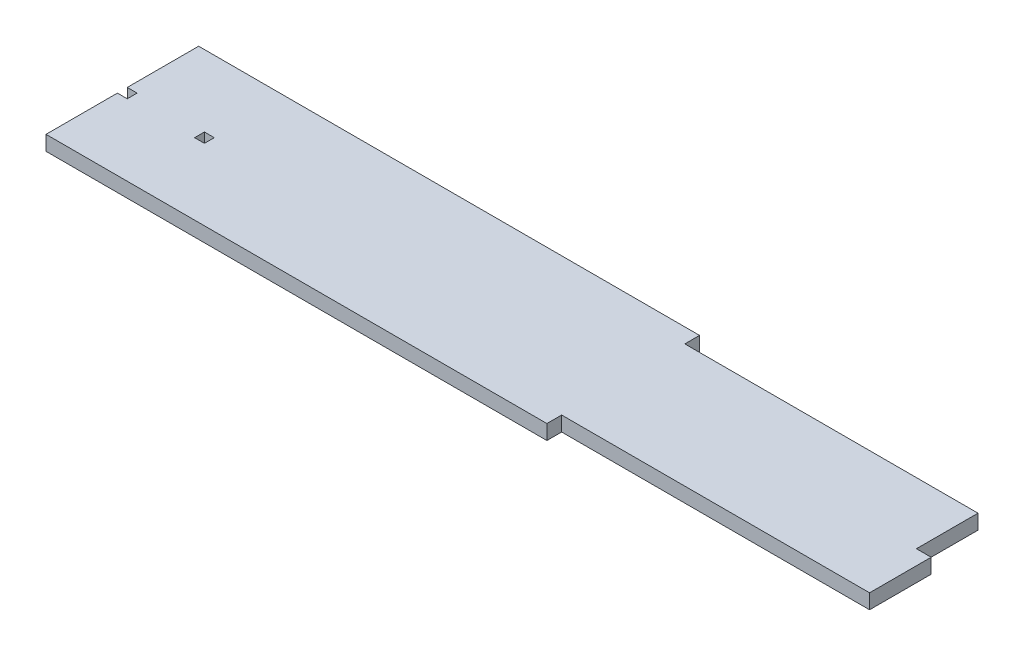
ISO-10303-21;
HEADER;
FILE_DESCRIPTION(('STEP AP214'),'2;1');
FILE_NAME('part.step','',(''),(''),'','','');
FILE_SCHEMA(('AUTOMOTIVE_DESIGN { 1 0 10303 214 1 1 1 1 }'));
ENDSEC;
DATA;
#1=APPLICATION_CONTEXT('core data for automotive mechanical design processes');
#2=APPLICATION_PROTOCOL_DEFINITION('international standard','automotive_design',2000,#1);
#3=PRODUCT_CONTEXT('',#1,'mechanical');
#4=PRODUCT('Part','Part','',(#3));
#5=PRODUCT_RELATED_PRODUCT_CATEGORY('part','',(#4));
#6=PRODUCT_DEFINITION_FORMATION('','',#4);
#7=PRODUCT_DEFINITION_CONTEXT('part definition',#1,'design');
#8=PRODUCT_DEFINITION('design','',#6,#7);
#9=PRODUCT_DEFINITION_SHAPE('','',#8);
#10=(LENGTH_UNIT() NAMED_UNIT(*) SI_UNIT(.MILLI.,.METRE.));
#11=(NAMED_UNIT(*) PLANE_ANGLE_UNIT() SI_UNIT($,.RADIAN.));
#12=(NAMED_UNIT(*) SI_UNIT($,.STERADIAN.) SOLID_ANGLE_UNIT());
#13=UNCERTAINTY_MEASURE_WITH_UNIT(LENGTH_MEASURE(1.E-05),#10,'distance_accuracy_value','');
#14=(GEOMETRIC_REPRESENTATION_CONTEXT(3) GLOBAL_UNCERTAINTY_ASSIGNED_CONTEXT((#13)) GLOBAL_UNIT_ASSIGNED_CONTEXT((#10,
#11,#12)) REPRESENTATION_CONTEXT('',''));
#15=CARTESIAN_POINT('',(0.,0.,0.));
#16=DIRECTION('',(0.,0.,1.));
#17=DIRECTION('',(1.,0.,0.));
#18=AXIS2_PLACEMENT_3D('',#15,#16,#17);
#19=CARTESIAN_POINT('',(0.,4.5593,-23.6093));
#20=DIRECTION('',(0.,0.,1.));
#21=DIRECTION('',(1.,0.,0.));
#22=AXIS2_PLACEMENT_3D('',#19,#20,#21);
#23=PLANE('',#22);
#24=DIRECTION('',(0.,1.,0.));
#25=VECTOR('',#24,1.);
#26=CARTESIAN_POINT('',(29.8450000000573,25.4000000000007,-23.6092999999844));
#27=LINE('',#26,#25);
#28=CARTESIAN_POINT('',(29.8450000000573,6.66133814775094E-13,-23.6092999999844));
#29=VERTEX_POINT('',#28);
#30=CARTESIAN_POINT('',(29.8450000000573,4.5593,-23.6092999999844));
#31=VERTEX_POINT('',#30);
#32=EDGE_CURVE('E237',#29,#31,#27,.T.);
#33=ORIENTED_EDGE('',*,*,#32,.F.);
#34=DIRECTION('',(-1.,0.,0.));
#35=VECTOR('',#34,1.);
#36=CARTESIAN_POINT('',(0.,0.,-23.6093));
#37=LINE('',#36,#35);
#38=CARTESIAN_POINT('',(-125.095,0.,-23.6093));
#39=VERTEX_POINT('',#38);
#40=EDGE_CURVE('E236',#29,#39,#37,.T.);
#41=ORIENTED_EDGE('',*,*,#40,.T.);
#42=DIRECTION('',(0.,-1.,0.));
#43=VECTOR('',#42,1.);
#44=CARTESIAN_POINT('',(-125.095,4.5593,-23.6093));
#45=LINE('',#44,#43);
#46=CARTESIAN_POINT('',(-125.095,4.5593,-23.6093));
#47=VERTEX_POINT('',#46);
#48=EDGE_CURVE('E38',#47,#39,#45,.T.);
#49=ORIENTED_EDGE('',*,*,#48,.F.);
#50=DIRECTION('',(-1.,0.,0.));
#51=VECTOR('',#50,1.);
#52=CARTESIAN_POINT('',(0.,4.5593,-23.6093));
#53=LINE('',#52,#51);
#54=EDGE_CURVE('E202',#31,#47,#53,.T.);
#55=ORIENTED_EDGE('',*,*,#54,.F.);
#56=EDGE_LOOP('',(#33,#41,#49,#55));
#57=FACE_BOUND('',#56,.T.);
#58=ADVANCED_FACE('F35',(#57),#23,.F.);
#59=CARTESIAN_POINT('',(0.,4.5593,23.6093));
#60=DIRECTION('',(0.,0.,1.));
#61=DIRECTION('',(1.,0.,0.));
#62=AXIS2_PLACEMENT_3D('',#59,#60,#61);
#63=PLANE('',#62);
#64=DIRECTION('',(-1.,0.,0.));
#65=VECTOR('',#64,1.);
#66=CARTESIAN_POINT('',(0.,0.,23.6093));
#67=LINE('',#66,#65);
#68=CARTESIAN_POINT('',(29.8449999999997,0.,23.6093));
#69=VERTEX_POINT('',#68);
#70=CARTESIAN_POINT('',(-125.095,0.,23.6093));
#71=VERTEX_POINT('',#70);
#72=EDGE_CURVE('E185',#69,#71,#67,.T.);
#73=ORIENTED_EDGE('',*,*,#72,.F.);
#74=DIRECTION('',(0.,1.,0.));
#75=VECTOR('',#74,1.);
#76=CARTESIAN_POINT('',(29.8449999999997,25.4,23.6093000000018));
#77=LINE('',#76,#75);
#78=CARTESIAN_POINT('',(29.8449999999997,4.5593,23.6093000000018));
#79=VERTEX_POINT('',#78);
#80=EDGE_CURVE('E59',#69,#79,#77,.T.);
#81=ORIENTED_EDGE('',*,*,#80,.T.);
#82=DIRECTION('',(-1.,0.,0.));
#83=VECTOR('',#82,1.);
#84=CARTESIAN_POINT('',(0.,4.5593,23.6093));
#85=LINE('',#84,#83);
#86=CARTESIAN_POINT('',(-125.095,4.5593,23.6093));
#87=VERTEX_POINT('',#86);
#88=EDGE_CURVE('E283',#79,#87,#85,.T.);
#89=ORIENTED_EDGE('',*,*,#88,.T.);
#90=DIRECTION('',(0.,-1.,0.));
#91=VECTOR('',#90,1.);
#92=CARTESIAN_POINT('',(-125.095,4.5593,23.6093));
#93=LINE('',#92,#91);
#94=EDGE_CURVE('E208',#87,#71,#93,.T.);
#95=ORIENTED_EDGE('',*,*,#94,.T.);
#96=EDGE_LOOP('',(#73,#81,#89,#95));
#97=FACE_BOUND('',#96,.T.);
#98=ADVANCED_FACE('F322',(#97),#63,.T.);
#99=CARTESIAN_POINT('',(125.095,4.5593,0.));
#100=DIRECTION('',(-1.,0.,0.));
#101=DIRECTION('',(0.,0.,1.));
#102=AXIS2_PLACEMENT_3D('',#99,#100,#101);
#103=PLANE('',#102);
#104=DIRECTION('',(0.,0.,-1.));
#105=VECTOR('',#104,1.);
#106=CARTESIAN_POINT('',(125.095,0.,0.));
#107=LINE('',#106,#105);
#108=CARTESIAN_POINT('',(125.095,0.,19.0500000000018));
#109=VERTEX_POINT('',#108);
#110=CARTESIAN_POINT('',(125.095000000057,4.19664303308309E-11,-4.47146659976472E-11));
#111=VERTEX_POINT('',#110);
#112=EDGE_CURVE('E176',#109,#111,#107,.T.);
#113=ORIENTED_EDGE('',*,*,#112,.T.);
#114=DIRECTION('',(0.,-1.,-1.91538589147791E-13));
#115=VECTOR('',#114,1.);
#116=CARTESIAN_POINT('',(125.095000000057,131.936735339986,-1.9443648080486E-11));
#117=LINE('',#116,#115);
#118=CARTESIAN_POINT('',(125.095000000057,4.55930000004198,-4.38412327274929E-11));
#119=VERTEX_POINT('',#118);
#120=EDGE_CURVE('E499',#119,#111,#117,.T.);
#121=ORIENTED_EDGE('',*,*,#120,.F.);
#122=DIRECTION('',(0.,0.,-1.));
#123=VECTOR('',#122,1.);
#124=CARTESIAN_POINT('',(125.095,4.5593,0.));
#125=LINE('',#124,#123);
#126=CARTESIAN_POINT('',(125.095000000057,4.55930000004193,19.0499999999556));
#127=VERTEX_POINT('',#126);
#128=EDGE_CURVE('E178',#127,#119,#125,.T.);
#129=ORIENTED_EDGE('',*,*,#128,.F.);
#130=DIRECTION('',(0.,-1.,0.));
#131=VECTOR('',#130,1.);
#132=CARTESIAN_POINT('',(125.095,25.4,19.0500000000018));
#133=LINE('',#132,#131);
#134=EDGE_CURVE('E165',#127,#109,#133,.T.);
#135=ORIENTED_EDGE('',*,*,#134,.T.);
#136=EDGE_LOOP('',(#113,#121,#129,#135));
#137=FACE_BOUND('',#136,.T.);
#138=ADVANCED_FACE('F174',(#137),#103,.F.);
#139=CARTESIAN_POINT('',(0.,4.5593,0.));
#140=DIRECTION('',(0.,1.,0.));
#141=DIRECTION('',(0.,0.,1.));
#142=AXIS2_PLACEMENT_3D('',#139,#140,#141);
#143=PLANE('',#142);
#144=DIRECTION('',(1.,0.,0.));
#145=VECTOR('',#144,1.);
#146=CARTESIAN_POINT('',(0.,4.5593,-1.52400000000001));
#147=LINE('',#146,#145);
#148=CARTESIAN_POINT('',(-101.219,4.5593,-1.52400000000001));
#149=VERTEX_POINT('',#148);
#150=CARTESIAN_POINT('',(-98.171,4.5593,-1.52400000000001));
#151=VERTEX_POINT('',#150);
#152=EDGE_CURVE('E286',#149,#151,#147,.T.);
#153=ORIENTED_EDGE('',*,*,#152,.T.);
#154=DIRECTION('',(0.,0.,1.));
#155=VECTOR('',#154,1.);
#156=CARTESIAN_POINT('',(-98.171,4.5593,0.));
#157=LINE('',#156,#155);
#158=CARTESIAN_POINT('',(-98.171,4.5593,1.52399999999999));
#159=VERTEX_POINT('',#158);
#160=EDGE_CURVE('E289',#151,#159,#157,.T.);
#161=ORIENTED_EDGE('',*,*,#160,.T.);
#162=DIRECTION('',(1.,0.,0.));
#163=VECTOR('',#162,1.);
#164=CARTESIAN_POINT('',(0.,4.5593,1.52399999999999));
#165=LINE('',#164,#163);
#166=CARTESIAN_POINT('',(-101.219,4.5593,1.52399999999999));
#167=VERTEX_POINT('',#166);
#168=EDGE_CURVE('E291',#167,#159,#165,.T.);
#169=ORIENTED_EDGE('',*,*,#168,.F.);
#170=DIRECTION('',(0.,0.,1.));
#171=VECTOR('',#170,1.);
#172=CARTESIAN_POINT('',(-101.219,4.5593,0.));
#173=LINE('',#172,#171);
#174=EDGE_CURVE('E212',#149,#167,#173,.T.);
#175=ORIENTED_EDGE('',*,*,#174,.F.);
#176=EDGE_LOOP('',(#153,#161,#169,#175));
#177=FACE_BOUND('',#176,.T.);
#178=DIRECTION('',(1.,0.,0.));
#179=VECTOR('',#178,1.);
#180=CARTESIAN_POINT('',(0.,4.5593,-19.0499999999844));
#181=LINE('',#180,#179);
#182=CARTESIAN_POINT('',(29.8450000000573,4.5593,-19.0499999999844));
#183=VERTEX_POINT('',#182);
#184=CARTESIAN_POINT('',(120.535700000057,4.55929999999999,-19.0500000000438));
#185=VERTEX_POINT('',#184);
#186=EDGE_CURVE('E490',#183,#185,#181,.T.);
#187=ORIENTED_EDGE('',*,*,#186,.F.);
#188=DIRECTION('',(0.,0.,-1.));
#189=VECTOR('',#188,1.);
#190=CARTESIAN_POINT('',(29.8450000000573,4.5593,0.));
#191=LINE('',#190,#189);
#192=EDGE_CURVE('E505',#183,#31,#191,.T.);
#193=ORIENTED_EDGE('',*,*,#192,.T.);
#194=ORIENTED_EDGE('',*,*,#54,.T.);
#195=DIRECTION('',(0.,0.,1.));
#196=VECTOR('',#195,1.);
#197=CARTESIAN_POINT('',(-125.095,4.5593,-1.57212432325443E-13));
#198=LINE('',#197,#196);
#199=CARTESIAN_POINT('',(-125.095,4.5593,-1.524));
#200=VERTEX_POINT('',#199);
#201=EDGE_CURVE('E231',#47,#200,#198,.T.);
#202=ORIENTED_EDGE('',*,*,#201,.T.);
#203=DIRECTION('',(1.,0.,0.));
#204=VECTOR('',#203,1.);
#205=CARTESIAN_POINT('',(0.,4.5593,-1.5240000000006));
#206=LINE('',#205,#204);
#207=CARTESIAN_POINT('',(-122.047,4.5593,-1.52400000000001));
#208=VERTEX_POINT('',#207);
#209=EDGE_CURVE('E272',#200,#208,#206,.T.);
#210=ORIENTED_EDGE('',*,*,#209,.T.);
#211=DIRECTION('',(0.,0.,1.));
#212=VECTOR('',#211,1.);
#213=CARTESIAN_POINT('',(-122.047,4.5593,0.));
#214=LINE('',#213,#212);
#215=CARTESIAN_POINT('',(-122.047,4.5593,1.52399999999999));
#216=VERTEX_POINT('',#215);
#217=EDGE_CURVE('E270',#208,#216,#214,.T.);
#218=ORIENTED_EDGE('',*,*,#217,.T.);
#219=DIRECTION('',(1.,0.,0.));
#220=VECTOR('',#219,1.);
#221=CARTESIAN_POINT('',(0.,4.5593,1.52399999999999));
#222=LINE('',#221,#220);
#223=CARTESIAN_POINT('',(-125.095,4.5593,1.52399999999999));
#224=VERTEX_POINT('',#223);
#225=EDGE_CURVE('E265',#224,#216,#222,.T.);
#226=ORIENTED_EDGE('',*,*,#225,.F.);
#227=DIRECTION('',(0.,0.,1.));
#228=VECTOR('',#227,1.);
#229=CARTESIAN_POINT('',(-125.095,4.5593,1.57212432325442E-13));
#230=LINE('',#229,#228);
#231=EDGE_CURVE('E280',#224,#87,#230,.T.);
#232=ORIENTED_EDGE('',*,*,#231,.T.);
#233=ORIENTED_EDGE('',*,*,#88,.F.);
#234=DIRECTION('',(0.,0.,-1.));
#235=VECTOR('',#234,1.);
#236=CARTESIAN_POINT('',(29.8449999999997,4.5593,0.));
#237=LINE('',#236,#235);
#238=CARTESIAN_POINT('',(29.8449999999997,4.5593,19.0500000000018));
#239=VERTEX_POINT('',#238);
#240=EDGE_CURVE('E496',#79,#239,#237,.T.);
#241=ORIENTED_EDGE('',*,*,#240,.T.);
#242=DIRECTION('',(1.,0.,0.));
#243=VECTOR('',#242,1.);
#244=CARTESIAN_POINT('',(0.,4.5593,19.0500000000018));
#245=LINE('',#244,#243);
#246=EDGE_CURVE('E503',#239,#127,#245,.T.);
#247=ORIENTED_EDGE('',*,*,#246,.T.);
#248=ORIENTED_EDGE('',*,*,#128,.T.);
#249=DIRECTION('',(1.,0.,0.));
#250=VECTOR('',#249,1.);
#251=CARTESIAN_POINT('',(120.535700000057,4.55930000004198,-4.38405822061894E-11));
#252=LINE('',#251,#250);
#253=CARTESIAN_POINT('',(120.535700000057,4.55930000004198,-4.38405822061894E-11));
#254=VERTEX_POINT('',#253);
#255=EDGE_CURVE('E492',#254,#119,#252,.T.);
#256=ORIENTED_EDGE('',*,*,#255,.F.);
#257=DIRECTION('',(0.,0.,1.));
#258=VECTOR('',#257,1.);
#259=CARTESIAN_POINT('',(120.535700000057,4.5593,0.));
#260=LINE('',#259,#258);
#261=EDGE_CURVE('E239',#185,#254,#260,.T.);
#262=ORIENTED_EDGE('',*,*,#261,.F.);
#263=EDGE_LOOP('',(#187,#193,#194,#202,#210,#218,#226,#232,#233,#241,#247,#248,#256,#262));
#264=FACE_BOUND('',#263,.T.);
#265=ADVANCED_FACE('F302',(#177,#264),#143,.T.);
#266=CARTESIAN_POINT('',(0.,0.,0.));
#267=DIRECTION('',(0.,1.,0.));
#268=DIRECTION('',(0.,0.,1.));
#269=AXIS2_PLACEMENT_3D('',#266,#267,#268);
#270=PLANE('',#269);
#271=DIRECTION('',(1.,0.,0.));
#272=VECTOR('',#271,1.);
#273=CARTESIAN_POINT('',(0.,0.,-1.52400000000001));
#274=LINE('',#273,#272);
#275=CARTESIAN_POINT('',(-101.219,0.,-1.52400000000001));
#276=VERTEX_POINT('',#275);
#277=CARTESIAN_POINT('',(-98.171,0.,-1.52400000000001));
#278=VERTEX_POINT('',#277);
#279=EDGE_CURVE('E184',#276,#278,#274,.T.);
#280=ORIENTED_EDGE('',*,*,#279,.F.);
#281=DIRECTION('',(0.,0.,1.));
#282=VECTOR('',#281,1.);
#283=CARTESIAN_POINT('',(-101.219,0.,0.));
#284=LINE('',#283,#282);
#285=CARTESIAN_POINT('',(-101.219,0.,1.52399999999999));
#286=VERTEX_POINT('',#285);
#287=EDGE_CURVE('E199',#276,#286,#284,.T.);
#288=ORIENTED_EDGE('',*,*,#287,.T.);
#289=DIRECTION('',(1.,0.,0.));
#290=VECTOR('',#289,1.);
#291=CARTESIAN_POINT('',(0.,0.,1.52399999999999));
#292=LINE('',#291,#290);
#293=CARTESIAN_POINT('',(-98.171,0.,1.52399999999999));
#294=VERTEX_POINT('',#293);
#295=EDGE_CURVE('E196',#286,#294,#292,.T.);
#296=ORIENTED_EDGE('',*,*,#295,.T.);
#297=DIRECTION('',(0.,0.,1.));
#298=VECTOR('',#297,1.);
#299=CARTESIAN_POINT('',(-98.171,0.,0.));
#300=LINE('',#299,#298);
#301=EDGE_CURVE('E188',#278,#294,#300,.T.);
#302=ORIENTED_EDGE('',*,*,#301,.F.);
#303=EDGE_LOOP('',(#280,#288,#296,#302));
#304=FACE_BOUND('',#303,.T.);
#305=DIRECTION('',(0.,0.,1.));
#306=VECTOR('',#305,1.);
#307=CARTESIAN_POINT('',(120.535700000057,4.19664303308309E-11,1.7906999999562));
#308=LINE('',#307,#306);
#309=CARTESIAN_POINT('',(120.535700000057,6.65642060283137E-13,-19.0499999999844));
#310=VERTEX_POINT('',#309);
#311=CARTESIAN_POINT('',(120.535700000057,4.19664303308309E-11,-4.47140154763437E-11));
#312=VERTEX_POINT('',#311);
#313=EDGE_CURVE('E493',#310,#312,#308,.T.);
#314=ORIENTED_EDGE('',*,*,#313,.T.);
#315=DIRECTION('',(1.,0.,0.));
#316=VECTOR('',#315,1.);
#317=CARTESIAN_POINT('',(120.535700000057,4.19664303308309E-11,-4.47140154763437E-11));
#318=LINE('',#317,#316);
#319=EDGE_CURVE('E183',#312,#111,#318,.T.);
#320=ORIENTED_EDGE('',*,*,#319,.T.);
#321=ORIENTED_EDGE('',*,*,#112,.F.);
#322=DIRECTION('',(-1.,0.,0.));
#323=VECTOR('',#322,1.);
#324=CARTESIAN_POINT('',(125.095,0.,19.0500000000018));
#325=LINE('',#324,#323);
#326=CARTESIAN_POINT('',(29.8449999999997,0.,19.0500000000018));
#327=VERTEX_POINT('',#326);
#328=EDGE_CURVE('E162',#109,#327,#325,.T.);
#329=ORIENTED_EDGE('',*,*,#328,.T.);
#330=DIRECTION('',(0.,0.,1.));
#331=VECTOR('',#330,1.);
#332=CARTESIAN_POINT('',(29.8449999999997,0.,19.0500000000018));
#333=LINE('',#332,#331);
#334=EDGE_CURVE('E517',#327,#69,#333,.T.);
#335=ORIENTED_EDGE('',*,*,#334,.T.);
#336=ORIENTED_EDGE('',*,*,#72,.T.);
#337=DIRECTION('',(0.,0.,1.));
#338=VECTOR('',#337,1.);
#339=CARTESIAN_POINT('',(-125.095,0.,1.57212432325442E-13));
#340=LINE('',#339,#338);
#341=CARTESIAN_POINT('',(-125.095,0.,1.52399999999999));
#342=VERTEX_POINT('',#341);
#343=EDGE_CURVE('E190',#342,#71,#340,.T.);
#344=ORIENTED_EDGE('',*,*,#343,.F.);
#345=DIRECTION('',(1.,0.,0.));
#346=VECTOR('',#345,1.);
#347=CARTESIAN_POINT('',(0.,0.,1.52399999999999));
#348=LINE('',#347,#346);
#349=CARTESIAN_POINT('',(-122.047,0.,1.52399999999999));
#350=VERTEX_POINT('',#349);
#351=EDGE_CURVE('E250',#342,#350,#348,.T.);
#352=ORIENTED_EDGE('',*,*,#351,.T.);
#353=DIRECTION('',(0.,0.,1.));
#354=VECTOR('',#353,1.);
#355=CARTESIAN_POINT('',(-122.047,0.,0.));
#356=LINE('',#355,#354);
#357=CARTESIAN_POINT('',(-122.047,0.,-1.52400000000001));
#358=VERTEX_POINT('',#357);
#359=EDGE_CURVE('E244',#358,#350,#356,.T.);
#360=ORIENTED_EDGE('',*,*,#359,.F.);
#361=DIRECTION('',(1.,0.,0.));
#362=VECTOR('',#361,1.);
#363=CARTESIAN_POINT('',(0.,0.,-1.5240000000006));
#364=LINE('',#363,#362);
#365=CARTESIAN_POINT('',(-125.095,0.,-1.524));
#366=VERTEX_POINT('',#365);
#367=EDGE_CURVE('E242',#366,#358,#364,.T.);
#368=ORIENTED_EDGE('',*,*,#367,.F.);
#369=DIRECTION('',(0.,0.,1.));
#370=VECTOR('',#369,1.);
#371=CARTESIAN_POINT('',(-125.095,0.,-1.57212432325443E-13));
#372=LINE('',#371,#370);
#373=EDGE_CURVE('E230',#39,#366,#372,.T.);
#374=ORIENTED_EDGE('',*,*,#373,.F.);
#375=ORIENTED_EDGE('',*,*,#40,.F.);
#376=DIRECTION('',(0.,0.,1.));
#377=VECTOR('',#376,1.);
#378=CARTESIAN_POINT('',(29.8450000000573,6.66133814775094E-13,-23.6092999999844));
#379=LINE('',#378,#377);
#380=CARTESIAN_POINT('',(29.8450000000573,0.,-19.0499999999844));
#381=VERTEX_POINT('',#380);
#382=EDGE_CURVE('E511',#29,#381,#379,.T.);
#383=ORIENTED_EDGE('',*,*,#382,.T.);
#384=DIRECTION('',(-1.,0.,0.));
#385=VECTOR('',#384,1.);
#386=CARTESIAN_POINT('',(125.095000000057,6.66133814775094E-13,-19.0499999999844));
#387=LINE('',#386,#385);
#388=EDGE_CURVE('E509',#310,#381,#387,.T.);
#389=ORIENTED_EDGE('',*,*,#388,.F.);
#390=EDGE_LOOP('',(#314,#320,#321,#329,#335,#336,#344,#352,#360,#368,#374,#375,#383,#389));
#391=FACE_BOUND('',#390,.T.);
#392=ADVANCED_FACE('F182',(#304,#391),#270,.F.);
#393=CARTESIAN_POINT('',(0.,4.5593,-1.52400000000001));
#394=DIRECTION('',(0.,0.,-1.));
#395=DIRECTION('',(-1.,0.,0.));
#396=AXIS2_PLACEMENT_3D('',#393,#394,#395);
#397=PLANE('',#396);
#398=ORIENTED_EDGE('',*,*,#279,.T.);
#399=DIRECTION('',(0.,-1.,0.));
#400=VECTOR('',#399,1.);
#401=CARTESIAN_POINT('',(-98.171,4.5593,-1.52400000000001));
#402=LINE('',#401,#400);
#403=EDGE_CURVE('E11',#151,#278,#402,.T.);
#404=ORIENTED_EDGE('',*,*,#403,.F.);
#405=ORIENTED_EDGE('',*,*,#152,.F.);
#406=DIRECTION('',(0.,-1.,0.));
#407=VECTOR('',#406,1.);
#408=CARTESIAN_POINT('',(-101.219,4.5593,-1.52400000000001));
#409=LINE('',#408,#407);
#410=EDGE_CURVE('E203',#149,#276,#409,.T.);
#411=ORIENTED_EDGE('',*,*,#410,.T.);
#412=EDGE_LOOP('',(#398,#404,#405,#411));
#413=FACE_BOUND('',#412,.T.);
#414=ADVANCED_FACE('F310',(#413),#397,.F.);
#415=CARTESIAN_POINT('',(-98.171,4.5593,0.));
#416=DIRECTION('',(1.,0.,0.));
#417=DIRECTION('',(0.,0.,-1.));
#418=AXIS2_PLACEMENT_3D('',#415,#416,#417);
#419=PLANE('',#418);
#420=ORIENTED_EDGE('',*,*,#301,.T.);
#421=DIRECTION('',(0.,-1.,0.));
#422=VECTOR('',#421,1.);
#423=CARTESIAN_POINT('',(-98.171,4.5593,1.52399999999999));
#424=LINE('',#423,#422);
#425=EDGE_CURVE('E43',#159,#294,#424,.T.);
#426=ORIENTED_EDGE('',*,*,#425,.F.);
#427=ORIENTED_EDGE('',*,*,#160,.F.);
#428=ORIENTED_EDGE('',*,*,#403,.T.);
#429=EDGE_LOOP('',(#420,#426,#427,#428));
#430=FACE_BOUND('',#429,.T.);
#431=ADVANCED_FACE('F312',(#430),#419,.F.);
#432=CARTESIAN_POINT('',(0.,4.5593,1.52399999999999));
#433=DIRECTION('',(0.,0.,-1.));
#434=DIRECTION('',(-1.,0.,0.));
#435=AXIS2_PLACEMENT_3D('',#432,#433,#434);
#436=PLANE('',#435);
#437=ORIENTED_EDGE('',*,*,#295,.F.);
#438=DIRECTION('',(0.,-1.,0.));
#439=VECTOR('',#438,1.);
#440=CARTESIAN_POINT('',(-101.219,4.5593,1.52399999999999));
#441=LINE('',#440,#439);
#442=EDGE_CURVE('E205',#167,#286,#441,.T.);
#443=ORIENTED_EDGE('',*,*,#442,.F.);
#444=ORIENTED_EDGE('',*,*,#168,.T.);
#445=ORIENTED_EDGE('',*,*,#425,.T.);
#446=EDGE_LOOP('',(#437,#443,#444,#445));
#447=FACE_BOUND('',#446,.T.);
#448=ADVANCED_FACE('F306',(#447),#436,.T.);
#449=CARTESIAN_POINT('',(-125.095,4.5593,-1.57212432325443E-13));
#450=DIRECTION('',(1.,0.,0.));
#451=DIRECTION('',(0.,0.,-1.));
#452=AXIS2_PLACEMENT_3D('',#449,#450,#451);
#453=PLANE('',#452);
#454=ORIENTED_EDGE('',*,*,#373,.T.);
#455=DIRECTION('',(0.,-1.,0.));
#456=VECTOR('',#455,1.);
#457=CARTESIAN_POINT('',(-125.095,4.5593,-1.524));
#458=LINE('',#457,#456);
#459=EDGE_CURVE('E218',#200,#366,#458,.T.);
#460=ORIENTED_EDGE('',*,*,#459,.F.);
#461=ORIENTED_EDGE('',*,*,#201,.F.);
#462=ORIENTED_EDGE('',*,*,#48,.T.);
#463=EDGE_LOOP('',(#454,#460,#461,#462));
#464=FACE_BOUND('',#463,.T.);
#465=ADVANCED_FACE('F228',(#464),#453,.F.);
#466=CARTESIAN_POINT('',(0.,4.5593,-1.5240000000006));
#467=DIRECTION('',(0.,0.,-1.));
#468=DIRECTION('',(-1.,0.,0.));
#469=AXIS2_PLACEMENT_3D('',#466,#467,#468);
#470=PLANE('',#469);
#471=ORIENTED_EDGE('',*,*,#367,.T.);
#472=DIRECTION('',(0.,-1.,0.));
#473=VECTOR('',#472,1.);
#474=CARTESIAN_POINT('',(-122.047,4.5593,-1.52400000000001));
#475=LINE('',#474,#473);
#476=EDGE_CURVE('E216',#208,#358,#475,.T.);
#477=ORIENTED_EDGE('',*,*,#476,.F.);
#478=ORIENTED_EDGE('',*,*,#209,.F.);
#479=ORIENTED_EDGE('',*,*,#459,.T.);
#480=EDGE_LOOP('',(#471,#477,#478,#479));
#481=FACE_BOUND('',#480,.T.);
#482=ADVANCED_FACE('F271',(#481),#470,.F.);
#483=CARTESIAN_POINT('',(-122.047,4.5593,0.));
#484=DIRECTION('',(1.,0.,0.));
#485=DIRECTION('',(0.,0.,-1.));
#486=AXIS2_PLACEMENT_3D('',#483,#484,#485);
#487=PLANE('',#486);
#488=ORIENTED_EDGE('',*,*,#359,.T.);
#489=DIRECTION('',(0.,-1.,0.));
#490=VECTOR('',#489,1.);
#491=CARTESIAN_POINT('',(-122.047,4.5593,1.52399999999999));
#492=LINE('',#491,#490);
#493=EDGE_CURVE('E214',#216,#350,#492,.T.);
#494=ORIENTED_EDGE('',*,*,#493,.F.);
#495=ORIENTED_EDGE('',*,*,#217,.F.);
#496=ORIENTED_EDGE('',*,*,#476,.T.);
#497=EDGE_LOOP('',(#488,#494,#495,#496));
#498=FACE_BOUND('',#497,.T.);
#499=ADVANCED_FACE('F268',(#498),#487,.F.);
#500=CARTESIAN_POINT('',(0.,4.5593,1.52399999999999));
#501=DIRECTION('',(0.,0.,-1.));
#502=DIRECTION('',(-1.,0.,0.));
#503=AXIS2_PLACEMENT_3D('',#500,#501,#502);
#504=PLANE('',#503);
#505=ORIENTED_EDGE('',*,*,#351,.F.);
#506=DIRECTION('',(0.,-1.,0.));
#507=VECTOR('',#506,1.);
#508=CARTESIAN_POINT('',(-125.095,4.5593,1.52399999999999));
#509=LINE('',#508,#507);
#510=EDGE_CURVE('E211',#224,#342,#509,.T.);
#511=ORIENTED_EDGE('',*,*,#510,.F.);
#512=ORIENTED_EDGE('',*,*,#225,.T.);
#513=ORIENTED_EDGE('',*,*,#493,.T.);
#514=EDGE_LOOP('',(#505,#511,#512,#513));
#515=FACE_BOUND('',#514,.T.);
#516=ADVANCED_FACE('F261',(#515),#504,.T.);
#517=CARTESIAN_POINT('',(-125.095,4.5593,1.57212432325442E-13));
#518=DIRECTION('',(1.,0.,0.));
#519=DIRECTION('',(0.,0.,-1.));
#520=AXIS2_PLACEMENT_3D('',#517,#518,#519);
#521=PLANE('',#520);
#522=ORIENTED_EDGE('',*,*,#343,.T.);
#523=ORIENTED_EDGE('',*,*,#94,.F.);
#524=ORIENTED_EDGE('',*,*,#231,.F.);
#525=ORIENTED_EDGE('',*,*,#510,.T.);
#526=EDGE_LOOP('',(#522,#523,#524,#525));
#527=FACE_BOUND('',#526,.T.);
#528=ADVANCED_FACE('F256',(#527),#521,.F.);
#529=CARTESIAN_POINT('',(-101.219,4.5593,0.));
#530=DIRECTION('',(1.,0.,0.));
#531=DIRECTION('',(0.,0.,-1.));
#532=AXIS2_PLACEMENT_3D('',#529,#530,#531);
#533=PLANE('',#532);
#534=ORIENTED_EDGE('',*,*,#287,.F.);
#535=ORIENTED_EDGE('',*,*,#410,.F.);
#536=ORIENTED_EDGE('',*,*,#174,.T.);
#537=ORIENTED_EDGE('',*,*,#442,.T.);
#538=EDGE_LOOP('',(#534,#535,#536,#537));
#539=FACE_BOUND('',#538,.T.);
#540=ADVANCED_FACE('F297',(#539),#533,.T.);
#541=CARTESIAN_POINT('',(29.8449999999997,25.4,19.0500000000018));
#542=DIRECTION('',(1.,0.,0.));
#543=DIRECTION('',(0.,0.,1.));
#544=AXIS2_PLACEMENT_3D('',#541,#542,#543);
#545=PLANE('',#544);
#546=ORIENTED_EDGE('',*,*,#80,.F.);
#547=ORIENTED_EDGE('',*,*,#334,.F.);
#548=DIRECTION('',(0.,1.,0.));
#549=VECTOR('',#548,1.);
#550=CARTESIAN_POINT('',(29.8449999999997,25.4,19.0500000000018));
#551=LINE('',#550,#549);
#552=EDGE_CURVE('E168',#327,#239,#551,.T.);
#553=ORIENTED_EDGE('',*,*,#552,.T.);
#554=ORIENTED_EDGE('',*,*,#240,.F.);
#555=EDGE_LOOP('',(#546,#547,#553,#554));
#556=FACE_BOUND('',#555,.T.);
#557=ADVANCED_FACE('F368',(#556),#545,.T.);
#558=CARTESIAN_POINT('',(-99.6950000000003,25.4,19.0500000000019));
#559=DIRECTION('',(0.,0.,1.));
#560=DIRECTION('',(-1.,0.,0.));
#561=AXIS2_PLACEMENT_3D('',#558,#559,#560);
#562=PLANE('',#561);
#563=ORIENTED_EDGE('',*,*,#552,.F.);
#564=ORIENTED_EDGE('',*,*,#328,.F.);
#565=ORIENTED_EDGE('',*,*,#134,.F.);
#566=ORIENTED_EDGE('',*,*,#246,.F.);
#567=EDGE_LOOP('',(#563,#564,#565,#566));
#568=FACE_BOUND('',#567,.T.);
#569=ADVANCED_FACE('F164',(#568),#562,.T.);
#570=CARTESIAN_POINT('',(120.535700000057,131.936735339986,1.79069999995662));
#571=DIRECTION('',(-1.,0.,0.));
#572=DIRECTION('',(0.,0.,1.));
#573=AXIS2_PLACEMENT_3D('',#570,#571,#572);
#574=PLANE('',#573);
#575=ORIENTED_EDGE('',*,*,#261,.T.);
#576=DIRECTION('',(0.,-1.,-1.91538589147791E-13));
#577=VECTOR('',#576,1.);
#578=CARTESIAN_POINT('',(120.535700000057,131.936735339986,-1.94429975591826E-11));
#579=LINE('',#578,#577);
#580=EDGE_CURVE('E486',#254,#312,#579,.T.);
#581=ORIENTED_EDGE('',*,*,#580,.T.);
#582=ORIENTED_EDGE('',*,*,#313,.F.);
#583=DIRECTION('',(0.,1.,0.));
#584=VECTOR('',#583,1.);
#585=CARTESIAN_POINT('',(120.535700000057,131.936735339986,-19.0500000000434));
#586=LINE('',#585,#584);
#587=EDGE_CURVE('E487',#310,#185,#586,.T.);
#588=ORIENTED_EDGE('',*,*,#587,.T.);
#589=EDGE_LOOP('',(#575,#581,#582,#588));
#590=FACE_BOUND('',#589,.T.);
#591=ADVANCED_FACE('F382',(#590),#574,.F.);
#592=CARTESIAN_POINT('',(120.535700000057,131.936735339986,-1.94429975591826E-11));
#593=DIRECTION('',(0.,-1.9153858914779E-13,1.));
#594=DIRECTION('',(0.,1.,1.91538589147791E-13));
#595=AXIS2_PLACEMENT_3D('',#592,#593,#594);
#596=PLANE('',#595);
#597=ORIENTED_EDGE('',*,*,#120,.T.);
#598=ORIENTED_EDGE('',*,*,#319,.F.);
#599=ORIENTED_EDGE('',*,*,#580,.F.);
#600=ORIENTED_EDGE('',*,*,#255,.T.);
#601=EDGE_LOOP('',(#597,#598,#599,#600));
#602=FACE_BOUND('',#601,.T.);
#603=ADVANCED_FACE('F392',(#602),#596,.F.);
#604=CARTESIAN_POINT('',(-99.6949999999427,25.4000000000007,-19.0499999999844));
#605=DIRECTION('',(0.,0.,1.));
#606=DIRECTION('',(-1.,0.,0.));
#607=AXIS2_PLACEMENT_3D('',#604,#605,#606);
#608=PLANE('',#607);
#609=ORIENTED_EDGE('',*,*,#186,.T.);
#610=ORIENTED_EDGE('',*,*,#587,.F.);
#611=ORIENTED_EDGE('',*,*,#388,.T.);
#612=DIRECTION('',(0.,1.,0.));
#613=VECTOR('',#612,1.);
#614=CARTESIAN_POINT('',(29.8450000000573,25.4000000000007,-19.0499999999844));
#615=LINE('',#614,#613);
#616=EDGE_CURVE('E51',#381,#183,#615,.T.);
#617=ORIENTED_EDGE('',*,*,#616,.T.);
#618=EDGE_LOOP('',(#609,#610,#611,#617));
#619=FACE_BOUND('',#618,.T.);
#620=ADVANCED_FACE('F387',(#619),#608,.F.);
#621=CARTESIAN_POINT('',(29.8450000000573,25.4000000000007,-23.6092999999844));
#622=DIRECTION('',(1.,0.,0.));
#623=DIRECTION('',(0.,0.,1.));
#624=AXIS2_PLACEMENT_3D('',#621,#622,#623);
#625=PLANE('',#624);
#626=ORIENTED_EDGE('',*,*,#616,.F.);
#627=ORIENTED_EDGE('',*,*,#382,.F.);
#628=ORIENTED_EDGE('',*,*,#32,.T.);
#629=ORIENTED_EDGE('',*,*,#192,.F.);
#630=EDGE_LOOP('',(#626,#627,#628,#629));
#631=FACE_BOUND('',#630,.T.);
#632=ADVANCED_FACE('F391',(#631),#625,.T.);
#633=CLOSED_SHELL('',(#58,#98,#138,#265,#392,#414,#431,#448,#465,#482,#499,#516,#528,#540,#557,
#569,#591,#603,#620,#632));
#634=MANIFOLD_SOLID_BREP('B2',#633);
#635=ADVANCED_BREP_SHAPE_REPRESENTATION('',(#18,#634),#14);
#636=SHAPE_DEFINITION_REPRESENTATION(#9,#635);
ENDSEC;
END-ISO-10303-21;
